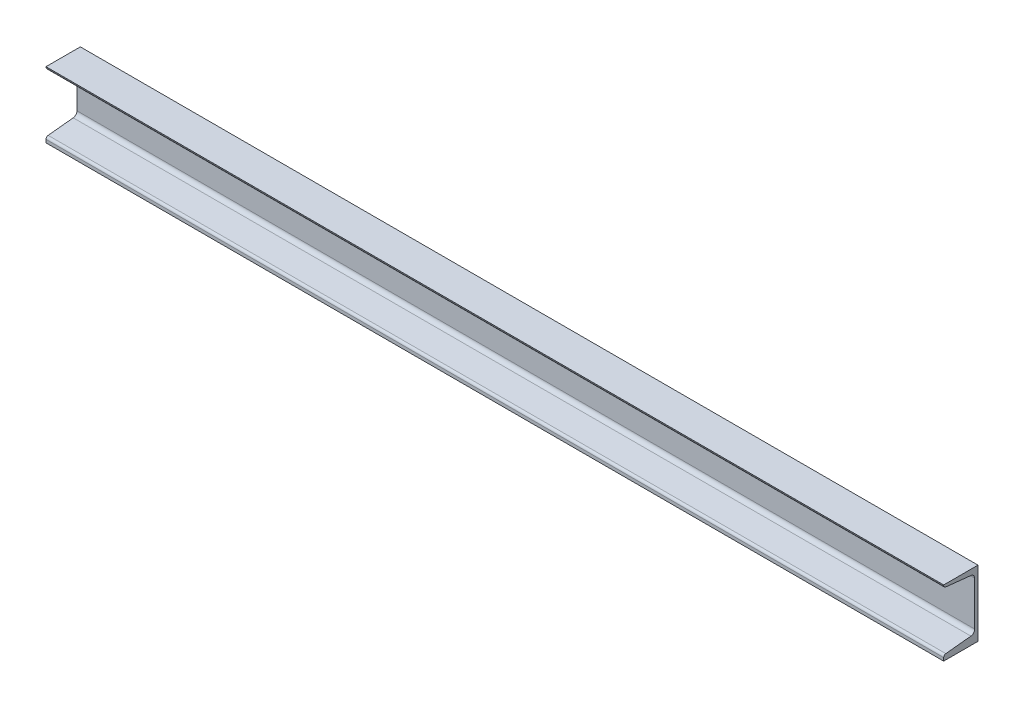
ISO-10303-21;
HEADER;
FILE_DESCRIPTION(('STEP AP214'),'2;1');
FILE_NAME('part.step','',(''),(''),'','','');
FILE_SCHEMA(('AUTOMOTIVE_DESIGN { 1 0 10303 214 1 1 1 1 }'));
ENDSEC;
DATA;
#1=APPLICATION_CONTEXT('core data for automotive mechanical design processes');
#2=APPLICATION_PROTOCOL_DEFINITION('international standard','automotive_design',2000,#1);
#3=PRODUCT_CONTEXT('',#1,'mechanical');
#4=PRODUCT('Part','Part','',(#3));
#5=PRODUCT_RELATED_PRODUCT_CATEGORY('part','',(#4));
#6=PRODUCT_DEFINITION_FORMATION('','',#4);
#7=PRODUCT_DEFINITION_CONTEXT('part definition',#1,'design');
#8=PRODUCT_DEFINITION('design','',#6,#7);
#9=PRODUCT_DEFINITION_SHAPE('','',#8);
#10=(LENGTH_UNIT() NAMED_UNIT(*) SI_UNIT(.MILLI.,.METRE.));
#11=(NAMED_UNIT(*) PLANE_ANGLE_UNIT() SI_UNIT($,.RADIAN.));
#12=(NAMED_UNIT(*) SI_UNIT($,.STERADIAN.) SOLID_ANGLE_UNIT());
#13=UNCERTAINTY_MEASURE_WITH_UNIT(LENGTH_MEASURE(1.E-05),#10,'distance_accuracy_value','');
#14=(GEOMETRIC_REPRESENTATION_CONTEXT(3) GLOBAL_UNCERTAINTY_ASSIGNED_CONTEXT((#13)) GLOBAL_UNIT_ASSIGNED_CONTEXT((#10,
#11,#12)) REPRESENTATION_CONTEXT('',''));
#15=CARTESIAN_POINT('',(0.,0.,0.));
#16=DIRECTION('',(0.,0.,1.));
#17=DIRECTION('',(1.,0.,0.));
#18=AXIS2_PLACEMENT_3D('',#15,#16,#17);
#19=CARTESIAN_POINT('',(-1700.,124.164669163818,60.5));
#20=DIRECTION('',(1.,0.,0.));
#21=DIRECTION('',(0.,0.,-1.));
#22=AXIS2_PLACEMENT_3D('',#19,#20,#21);
#23=CYLINDRICAL_SURFACE('',#22,4.49999999999999);
#24=CARTESIAN_POINT('',(0.,124.164669163818,60.5));
#25=DIRECTION('',(-1.,0.,0.));
#26=DIRECTION('',(0.,0.,1.));
#27=AXIS2_PLACEMENT_3D('',#24,#25,#26);
#28=CIRCLE('',#27,4.49999999999999);
#29=CARTESIAN_POINT('',(0.,119.689320634661,60.9703780847044));
#30=VERTEX_POINT('',#29);
#31=CARTESIAN_POINT('',(0.,124.164669163818,65.));
#32=VERTEX_POINT('',#31);
#33=EDGE_CURVE('E200',#30,#32,#28,.T.);
#34=ORIENTED_EDGE('',*,*,#33,.T.);
#35=DIRECTION('',(1.,0.,0.));
#36=VECTOR('',#35,1.);
#37=CARTESIAN_POINT('',(-1700.,124.164669163818,65.));
#38=LINE('',#37,#36);
#39=CARTESIAN_POINT('',(-1700.,124.164669163818,65.));
#40=VERTEX_POINT('',#39);
#41=EDGE_CURVE('E13',#40,#32,#38,.T.);
#42=ORIENTED_EDGE('',*,*,#41,.F.);
#43=CARTESIAN_POINT('',(-1700.,124.164669163818,60.5));
#44=DIRECTION('',(-1.,0.,0.));
#45=DIRECTION('',(0.,0.,1.));
#46=AXIS2_PLACEMENT_3D('',#43,#44,#45);
#47=CIRCLE('',#46,4.49999999999999);
#48=CARTESIAN_POINT('',(-1700.,119.689320634661,60.9703780847044));
#49=VERTEX_POINT('',#48);
#50=EDGE_CURVE('E222',#49,#40,#47,.T.);
#51=ORIENTED_EDGE('',*,*,#50,.F.);
#52=DIRECTION('',(1.,0.,0.));
#53=VECTOR('',#52,1.);
#54=CARTESIAN_POINT('',(-1700.,119.689320634661,60.9703780847044));
#55=LINE('',#54,#53);
#56=EDGE_CURVE('E196',#49,#30,#55,.T.);
#57=ORIENTED_EDGE('',*,*,#56,.T.);
#58=EDGE_LOOP('',(#34,#42,#51,#57));
#59=FACE_BOUND('',#58,.T.);
#60=ADVANCED_FACE('F80',(#59),#23,.T.);
#61=CARTESIAN_POINT('',(-1700.,125.,65.));
#62=DIRECTION('',(0.,0.,-1.));
#63=DIRECTION('',(-1.,0.,0.));
#64=AXIS2_PLACEMENT_3D('',#61,#62,#63);
#65=PLANE('',#64);
#66=DIRECTION('',(0.,1.,0.));
#67=VECTOR('',#66,1.);
#68=CARTESIAN_POINT('',(0.,125.,65.));
#69=LINE('',#68,#67);
#70=CARTESIAN_POINT('',(0.,125.,65.));
#71=VERTEX_POINT('',#70);
#72=EDGE_CURVE('E203',#32,#71,#69,.T.);
#73=ORIENTED_EDGE('',*,*,#72,.T.);
#74=DIRECTION('',(1.,0.,0.));
#75=VECTOR('',#74,1.);
#76=CARTESIAN_POINT('',(-1700.,125.,65.));
#77=LINE('',#76,#75);
#78=CARTESIAN_POINT('',(-1700.,125.,65.));
#79=VERTEX_POINT('',#78);
#80=EDGE_CURVE('E88',#79,#71,#77,.T.);
#81=ORIENTED_EDGE('',*,*,#80,.F.);
#82=DIRECTION('',(0.,1.,0.));
#83=VECTOR('',#82,1.);
#84=CARTESIAN_POINT('',(-1700.,125.,65.));
#85=LINE('',#84,#83);
#86=EDGE_CURVE('E151',#40,#79,#85,.T.);
#87=ORIENTED_EDGE('',*,*,#86,.F.);
#88=ORIENTED_EDGE('',*,*,#41,.T.);
#89=EDGE_LOOP('',(#73,#81,#87,#88));
#90=FACE_BOUND('',#89,.T.);
#91=ADVANCED_FACE('F300',(#90),#65,.F.);
#92=CARTESIAN_POINT('',(-1700.,125.,65.));
#93=DIRECTION('',(0.,-1.,0.));
#94=DIRECTION('',(0.,0.,-1.));
#95=AXIS2_PLACEMENT_3D('',#92,#93,#94);
#96=PLANE('',#95);
#97=DIRECTION('',(0.,0.,-1.));
#98=VECTOR('',#97,1.);
#99=CARTESIAN_POINT('',(0.,125.,65.));
#100=LINE('',#99,#98);
#101=CARTESIAN_POINT('',(0.,125.,0.));
#102=VERTEX_POINT('',#101);
#103=EDGE_CURVE('E205',#71,#102,#100,.T.);
#104=ORIENTED_EDGE('',*,*,#103,.T.);
#105=DIRECTION('',(1.,0.,0.));
#106=VECTOR('',#105,1.);
#107=CARTESIAN_POINT('',(-1700.,125.,0.));
#108=LINE('',#107,#106);
#109=CARTESIAN_POINT('',(-1700.,125.,0.));
#110=VERTEX_POINT('',#109);
#111=EDGE_CURVE('E241',#110,#102,#108,.T.);
#112=ORIENTED_EDGE('',*,*,#111,.F.);
#113=DIRECTION('',(0.,0.,-1.));
#114=VECTOR('',#113,1.);
#115=CARTESIAN_POINT('',(-1700.,125.,65.));
#116=LINE('',#115,#114);
#117=EDGE_CURVE('E249',#79,#110,#116,.T.);
#118=ORIENTED_EDGE('',*,*,#117,.F.);
#119=ORIENTED_EDGE('',*,*,#80,.T.);
#120=EDGE_LOOP('',(#104,#112,#118,#119));
#121=FACE_BOUND('',#120,.T.);
#122=ADVANCED_FACE('F247',(#121),#96,.F.);
#123=CARTESIAN_POINT('',(-1700.,125.,0.));
#124=DIRECTION('',(0.,0.,1.));
#125=DIRECTION('',(0.,-1.,0.));
#126=AXIS2_PLACEMENT_3D('',#123,#124,#125);
#127=PLANE('',#126);
#128=DIRECTION('',(0.,-1.,0.));
#129=VECTOR('',#128,1.);
#130=CARTESIAN_POINT('',(0.,125.,0.));
#131=LINE('',#130,#129);
#132=CARTESIAN_POINT('',(0.,0.,0.));
#133=VERTEX_POINT('',#132);
#134=EDGE_CURVE('E207',#102,#133,#131,.T.);
#135=ORIENTED_EDGE('',*,*,#134,.T.);
#136=DIRECTION('',(1.,0.,0.));
#137=VECTOR('',#136,1.);
#138=CARTESIAN_POINT('',(-1700.,0.,0.));
#139=LINE('',#138,#137);
#140=CARTESIAN_POINT('',(-1700.,0.,0.));
#141=VERTEX_POINT('',#140);
#142=EDGE_CURVE('E238',#141,#133,#139,.T.);
#143=ORIENTED_EDGE('',*,*,#142,.F.);
#144=DIRECTION('',(0.,-1.,0.));
#145=VECTOR('',#144,1.);
#146=CARTESIAN_POINT('',(-1700.,125.,0.));
#147=LINE('',#146,#145);
#148=EDGE_CURVE('E267',#110,#141,#147,.T.);
#149=ORIENTED_EDGE('',*,*,#148,.F.);
#150=ORIENTED_EDGE('',*,*,#111,.T.);
#151=EDGE_LOOP('',(#135,#143,#149,#150));
#152=FACE_BOUND('',#151,.T.);
#153=ADVANCED_FACE('F258',(#152),#127,.F.);
#154=CARTESIAN_POINT('',(-1700.,0.,65.));
#155=DIRECTION('',(0.,1.,0.));
#156=DIRECTION('',(0.,0.,1.));
#157=AXIS2_PLACEMENT_3D('',#154,#155,#156);
#158=PLANE('',#157);
#159=DIRECTION('',(0.,0.,1.));
#160=VECTOR('',#159,1.);
#161=CARTESIAN_POINT('',(0.,0.,65.));
#162=LINE('',#161,#160);
#163=CARTESIAN_POINT('',(0.,0.,65.));
#164=VERTEX_POINT('',#163);
#165=EDGE_CURVE('E209',#133,#164,#162,.T.);
#166=ORIENTED_EDGE('',*,*,#165,.T.);
#167=DIRECTION('',(1.,0.,0.));
#168=VECTOR('',#167,1.);
#169=CARTESIAN_POINT('',(-1700.,0.,65.));
#170=LINE('',#169,#168);
#171=CARTESIAN_POINT('',(-1700.,0.,65.));
#172=VERTEX_POINT('',#171);
#173=EDGE_CURVE('E235',#172,#164,#170,.T.);
#174=ORIENTED_EDGE('',*,*,#173,.F.);
#175=DIRECTION('',(0.,0.,1.));
#176=VECTOR('',#175,1.);
#177=CARTESIAN_POINT('',(-1700.,0.,65.));
#178=LINE('',#177,#176);
#179=EDGE_CURVE('E264',#141,#172,#178,.T.);
#180=ORIENTED_EDGE('',*,*,#179,.F.);
#181=ORIENTED_EDGE('',*,*,#142,.T.);
#182=EDGE_LOOP('',(#166,#174,#180,#181));
#183=FACE_BOUND('',#182,.T.);
#184=ADVANCED_FACE('F262',(#183),#158,.F.);
#185=CARTESIAN_POINT('',(-1700.,0.,65.));
#186=DIRECTION('',(0.,0.,-1.));
#187=DIRECTION('',(-1.,0.,0.));
#188=AXIS2_PLACEMENT_3D('',#185,#186,#187);
#189=PLANE('',#188);
#190=DIRECTION('',(0.,1.,0.));
#191=VECTOR('',#190,1.);
#192=CARTESIAN_POINT('',(0.,0.,65.));
#193=LINE('',#192,#191);
#194=CARTESIAN_POINT('',(0.,5.8453308361821,65.));
#195=VERTEX_POINT('',#194);
#196=EDGE_CURVE('E211',#164,#195,#193,.T.);
#197=ORIENTED_EDGE('',*,*,#196,.T.);
#198=DIRECTION('',(1.,0.,0.));
#199=VECTOR('',#198,1.);
#200=CARTESIAN_POINT('',(-1700.,5.8453308361821,65.));
#201=LINE('',#200,#199);
#202=CARTESIAN_POINT('',(-1700.,5.8453308361821,65.));
#203=VERTEX_POINT('',#202);
#204=EDGE_CURVE('E232',#203,#195,#201,.T.);
#205=ORIENTED_EDGE('',*,*,#204,.F.);
#206=DIRECTION('',(0.,1.,0.));
#207=VECTOR('',#206,1.);
#208=CARTESIAN_POINT('',(-1700.,0.,65.));
#209=LINE('',#208,#207);
#210=EDGE_CURVE('E266',#172,#203,#209,.T.);
#211=ORIENTED_EDGE('',*,*,#210,.F.);
#212=ORIENTED_EDGE('',*,*,#173,.T.);
#213=EDGE_LOOP('',(#197,#205,#211,#212));
#214=FACE_BOUND('',#213,.T.);
#215=ADVANCED_FACE('F313',(#214),#189,.F.);
#216=CARTESIAN_POINT('',(-1700.,5.8453308361821,60.5));
#217=DIRECTION('',(1.,0.,0.));
#218=DIRECTION('',(0.,0.,-1.));
#219=AXIS2_PLACEMENT_3D('',#216,#217,#218);
#220=CYLINDRICAL_SURFACE('',#219,4.5);
#221=CARTESIAN_POINT('',(0.,5.8453308361821,60.5));
#222=DIRECTION('',(-1.,0.,0.));
#223=DIRECTION('',(0.,0.,-1.));
#224=AXIS2_PLACEMENT_3D('',#221,#222,#223);
#225=CIRCLE('',#224,4.5);
#226=CARTESIAN_POINT('',(0.,10.3206793653393,60.9703780847044));
#227=VERTEX_POINT('',#226);
#228=EDGE_CURVE('E213',#195,#227,#225,.T.);
#229=ORIENTED_EDGE('',*,*,#228,.T.);
#230=DIRECTION('',(1.,0.,0.));
#231=VECTOR('',#230,1.);
#232=CARTESIAN_POINT('',(-1700.,10.3206793653393,60.9703780847044));
#233=LINE('',#232,#231);
#234=CARTESIAN_POINT('',(-1700.,10.3206793653393,60.9703780847044));
#235=VERTEX_POINT('',#234);
#236=EDGE_CURVE('E229',#235,#227,#233,.T.);
#237=ORIENTED_EDGE('',*,*,#236,.F.);
#238=CARTESIAN_POINT('',(-1700.,5.8453308361821,60.5));
#239=DIRECTION('',(-1.,0.,0.));
#240=DIRECTION('',(0.,0.,-1.));
#241=AXIS2_PLACEMENT_3D('',#238,#239,#240);
#242=CIRCLE('',#241,4.5);
#243=EDGE_CURVE('E269',#203,#235,#242,.T.);
#244=ORIENTED_EDGE('',*,*,#243,.F.);
#245=ORIENTED_EDGE('',*,*,#204,.T.);
#246=EDGE_LOOP('',(#229,#237,#244,#245));
#247=FACE_BOUND('',#246,.T.);
#248=ADVANCED_FACE('F316',(#247),#220,.T.);
#249=CARTESIAN_POINT('',(-1700.,15.3138248370538,13.4637722938588));
#250=DIRECTION('',(0.,-0.994521895368274,-0.104528463267647));
#251=DIRECTION('',(0.,0.104528463267647,-0.994521895368274));
#252=AXIS2_PLACEMENT_3D('',#249,#250,#251);
#253=PLANE('',#252);
#254=DIRECTION('',(0.,0.104528463267647,-0.994521895368274));
#255=VECTOR('',#254,1.);
#256=CARTESIAN_POINT('',(0.,15.3138248370538,13.4637722938588));
#257=LINE('',#256,#255);
#258=CARTESIAN_POINT('',(0.,15.3138248370538,13.4637722938588));
#259=VERTEX_POINT('',#258);
#260=EDGE_CURVE('E215',#227,#259,#257,.T.);
#261=ORIENTED_EDGE('',*,*,#260,.T.);
#262=DIRECTION('',(1.,0.,0.));
#263=VECTOR('',#262,1.);
#264=CARTESIAN_POINT('',(-1700.,15.3138248370538,13.4637722938588));
#265=LINE('',#264,#263);
#266=CARTESIAN_POINT('',(-1700.,15.3138248370538,13.4637722938588));
#267=VERTEX_POINT('',#266);
#268=EDGE_CURVE('E226',#267,#259,#265,.T.);
#269=ORIENTED_EDGE('',*,*,#268,.F.);
#270=DIRECTION('',(0.,0.104528463267647,-0.994521895368274));
#271=VECTOR('',#270,1.);
#272=CARTESIAN_POINT('',(-1700.,15.3138248370538,13.4637722938588));
#273=LINE('',#272,#271);
#274=EDGE_CURVE('E275',#235,#267,#273,.T.);
#275=ORIENTED_EDGE('',*,*,#274,.F.);
#276=ORIENTED_EDGE('',*,*,#236,.T.);
#277=EDGE_LOOP('',(#261,#269,#275,#276));
#278=FACE_BOUND('',#277,.T.);
#279=ADVANCED_FACE('F281',(#278),#253,.F.);
#280=CARTESIAN_POINT('',(-1700.,23.27,14.3));
#281=DIRECTION('',(1.,0.,0.));
#282=DIRECTION('',(0.,0.,-1.));
#283=AXIS2_PLACEMENT_3D('',#280,#281,#282);
#284=CYLINDRICAL_SURFACE('',#283,8.);
#285=CARTESIAN_POINT('',(0.,23.27,14.3));
#286=DIRECTION('',(1.,0.,0.));
#287=DIRECTION('',(0.,0.,1.));
#288=AXIS2_PLACEMENT_3D('',#285,#286,#287);
#289=CIRCLE('',#288,8.);
#290=CARTESIAN_POINT('',(0.,23.27,6.30000000000001));
#291=VERTEX_POINT('',#290);
#292=EDGE_CURVE('E217',#259,#291,#289,.T.);
#293=ORIENTED_EDGE('',*,*,#292,.T.);
#294=DIRECTION('',(1.,0.,0.));
#295=VECTOR('',#294,1.);
#296=CARTESIAN_POINT('',(-1700.,23.27,6.30000000000001));
#297=LINE('',#296,#295);
#298=CARTESIAN_POINT('',(-1700.,23.27,6.30000000000001));
#299=VERTEX_POINT('',#298);
#300=EDGE_CURVE('E191',#299,#291,#297,.T.);
#301=ORIENTED_EDGE('',*,*,#300,.F.);
#302=CARTESIAN_POINT('',(-1700.,23.27,14.3));
#303=DIRECTION('',(1.,0.,0.));
#304=DIRECTION('',(0.,0.,1.));
#305=AXIS2_PLACEMENT_3D('',#302,#303,#304);
#306=CIRCLE('',#305,8.);
#307=EDGE_CURVE('E182',#267,#299,#306,.T.);
#308=ORIENTED_EDGE('',*,*,#307,.F.);
#309=ORIENTED_EDGE('',*,*,#268,.T.);
#310=EDGE_LOOP('',(#293,#301,#308,#309));
#311=FACE_BOUND('',#310,.T.);
#312=ADVANCED_FACE('F285',(#311),#284,.F.);
#313=CARTESIAN_POINT('',(-1700.,106.74,6.3));
#314=DIRECTION('',(0.,0.,-1.));
#315=DIRECTION('',(0.,1.,0.));
#316=AXIS2_PLACEMENT_3D('',#313,#314,#315);
#317=PLANE('',#316);
#318=DIRECTION('',(0.,1.,0.));
#319=VECTOR('',#318,1.);
#320=CARTESIAN_POINT('',(0.,106.74,6.3));
#321=LINE('',#320,#319);
#322=CARTESIAN_POINT('',(0.,106.74,6.3));
#323=VERTEX_POINT('',#322);
#324=EDGE_CURVE('E190',#291,#323,#321,.T.);
#325=ORIENTED_EDGE('',*,*,#324,.T.);
#326=DIRECTION('',(1.,0.,0.));
#327=VECTOR('',#326,1.);
#328=CARTESIAN_POINT('',(-1700.,106.74,6.3));
#329=LINE('',#328,#327);
#330=CARTESIAN_POINT('',(-1700.,106.74,6.3));
#331=VERTEX_POINT('',#330);
#332=EDGE_CURVE('E187',#331,#323,#329,.T.);
#333=ORIENTED_EDGE('',*,*,#332,.F.);
#334=DIRECTION('',(0.,1.,0.));
#335=VECTOR('',#334,1.);
#336=CARTESIAN_POINT('',(-1700.,106.74,6.3));
#337=LINE('',#336,#335);
#338=EDGE_CURVE('E176',#299,#331,#337,.T.);
#339=ORIENTED_EDGE('',*,*,#338,.F.);
#340=ORIENTED_EDGE('',*,*,#300,.T.);
#341=EDGE_LOOP('',(#325,#333,#339,#340));
#342=FACE_BOUND('',#341,.T.);
#343=ADVANCED_FACE('F188',(#342),#317,.F.);
#344=CARTESIAN_POINT('',(-1700.,106.74,14.3));
#345=DIRECTION('',(1.,0.,0.));
#346=DIRECTION('',(0.,0.,-1.));
#347=AXIS2_PLACEMENT_3D('',#344,#345,#346);
#348=CYLINDRICAL_SURFACE('',#347,8.);
#349=CARTESIAN_POINT('',(0.,106.74,14.3));
#350=DIRECTION('',(1.,0.,0.));
#351=DIRECTION('',(0.,0.,-1.));
#352=AXIS2_PLACEMENT_3D('',#349,#350,#351);
#353=CIRCLE('',#352,8.);
#354=CARTESIAN_POINT('',(0.,114.696175162946,13.4637722938588));
#355=VERTEX_POINT('',#354);
#356=EDGE_CURVE('E137',#323,#355,#353,.T.);
#357=ORIENTED_EDGE('',*,*,#356,.T.);
#358=DIRECTION('',(1.,0.,0.));
#359=VECTOR('',#358,1.);
#360=CARTESIAN_POINT('',(-1700.,114.696175162946,13.4637722938588));
#361=LINE('',#360,#359);
#362=CARTESIAN_POINT('',(-1700.,114.696175162946,13.4637722938588));
#363=VERTEX_POINT('',#362);
#364=EDGE_CURVE('E192',#363,#355,#361,.T.);
#365=ORIENTED_EDGE('',*,*,#364,.F.);
#366=CARTESIAN_POINT('',(-1700.,106.74,14.3));
#367=DIRECTION('',(1.,0.,0.));
#368=DIRECTION('',(0.,0.,-1.));
#369=AXIS2_PLACEMENT_3D('',#366,#367,#368);
#370=CIRCLE('',#369,8.);
#371=EDGE_CURVE('E180',#331,#363,#370,.T.);
#372=ORIENTED_EDGE('',*,*,#371,.F.);
#373=ORIENTED_EDGE('',*,*,#332,.T.);
#374=EDGE_LOOP('',(#357,#365,#372,#373));
#375=FACE_BOUND('',#374,.T.);
#376=ADVANCED_FACE('F194',(#375),#348,.F.);
#377=CARTESIAN_POINT('',(-1700.,114.696175162946,13.4637722938588));
#378=DIRECTION('',(0.,0.994521895368274,-0.104528463267646));
#379=DIRECTION('',(0.,0.104528463267646,0.994521895368274));
#380=AXIS2_PLACEMENT_3D('',#377,#378,#379);
#381=PLANE('',#380);
#382=DIRECTION('',(0.,0.104528463267646,0.994521895368274));
#383=VECTOR('',#382,1.);
#384=CARTESIAN_POINT('',(0.,114.696175162946,13.4637722938588));
#385=LINE('',#384,#383);
#386=EDGE_CURVE('E143',#355,#30,#385,.T.);
#387=ORIENTED_EDGE('',*,*,#386,.T.);
#388=ORIENTED_EDGE('',*,*,#56,.F.);
#389=DIRECTION('',(0.,0.104528463267646,0.994521895368274));
#390=VECTOR('',#389,1.);
#391=CARTESIAN_POINT('',(-1700.,114.696175162946,13.4637722938588));
#392=LINE('',#391,#390);
#393=EDGE_CURVE('E96',#363,#49,#392,.T.);
#394=ORIENTED_EDGE('',*,*,#393,.F.);
#395=ORIENTED_EDGE('',*,*,#364,.T.);
#396=EDGE_LOOP('',(#387,#388,#394,#395));
#397=FACE_BOUND('',#396,.T.);
#398=ADVANCED_FACE('F289',(#397),#381,.F.);
#399=CARTESIAN_POINT('',(-1700.,124.164669163818,60.5));
#400=DIRECTION('',(-1.,0.,0.));
#401=DIRECTION('',(0.,0.,1.));
#402=AXIS2_PLACEMENT_3D('',#399,#400,#401);
#403=PLANE('',#402);
#404=ORIENTED_EDGE('',*,*,#50,.T.);
#405=ORIENTED_EDGE('',*,*,#86,.T.);
#406=ORIENTED_EDGE('',*,*,#117,.T.);
#407=ORIENTED_EDGE('',*,*,#148,.T.);
#408=ORIENTED_EDGE('',*,*,#179,.T.);
#409=ORIENTED_EDGE('',*,*,#210,.T.);
#410=ORIENTED_EDGE('',*,*,#243,.T.);
#411=ORIENTED_EDGE('',*,*,#274,.T.);
#412=ORIENTED_EDGE('',*,*,#307,.T.);
#413=ORIENTED_EDGE('',*,*,#338,.T.);
#414=ORIENTED_EDGE('',*,*,#371,.T.);
#415=ORIENTED_EDGE('',*,*,#393,.T.);
#416=EDGE_LOOP('',(#404,#405,#406,#407,#408,#409,#410,#411,#412,#413,#414,#415));
#417=FACE_BOUND('',#416,.T.);
#418=ADVANCED_FACE('F178',(#417),#403,.T.);
#419=CARTESIAN_POINT('',(0.,124.164669163818,60.5));
#420=DIRECTION('',(-1.,0.,0.));
#421=DIRECTION('',(0.,0.,1.));
#422=AXIS2_PLACEMENT_3D('',#419,#420,#421);
#423=PLANE('',#422);
#424=ORIENTED_EDGE('',*,*,#33,.F.);
#425=ORIENTED_EDGE('',*,*,#386,.F.);
#426=ORIENTED_EDGE('',*,*,#356,.F.);
#427=ORIENTED_EDGE('',*,*,#324,.F.);
#428=ORIENTED_EDGE('',*,*,#292,.F.);
#429=ORIENTED_EDGE('',*,*,#260,.F.);
#430=ORIENTED_EDGE('',*,*,#228,.F.);
#431=ORIENTED_EDGE('',*,*,#196,.F.);
#432=ORIENTED_EDGE('',*,*,#165,.F.);
#433=ORIENTED_EDGE('',*,*,#134,.F.);
#434=ORIENTED_EDGE('',*,*,#103,.F.);
#435=ORIENTED_EDGE('',*,*,#72,.F.);
#436=EDGE_LOOP('',(#424,#425,#426,#427,#428,#429,#430,#431,#432,#433,#434,#435));
#437=FACE_BOUND('',#436,.T.);
#438=ADVANCED_FACE('F253',(#437),#423,.F.);
#439=CLOSED_SHELL('',(#60,#91,#122,#153,#184,#215,#248,#279,#312,#343,#376,#398,#418,#438));
#440=MANIFOLD_SOLID_BREP('B2',#439);
#441=ADVANCED_BREP_SHAPE_REPRESENTATION('',(#18,#440),#14);
#442=SHAPE_DEFINITION_REPRESENTATION(#9,#441);
ENDSEC;
END-ISO-10303-21;
